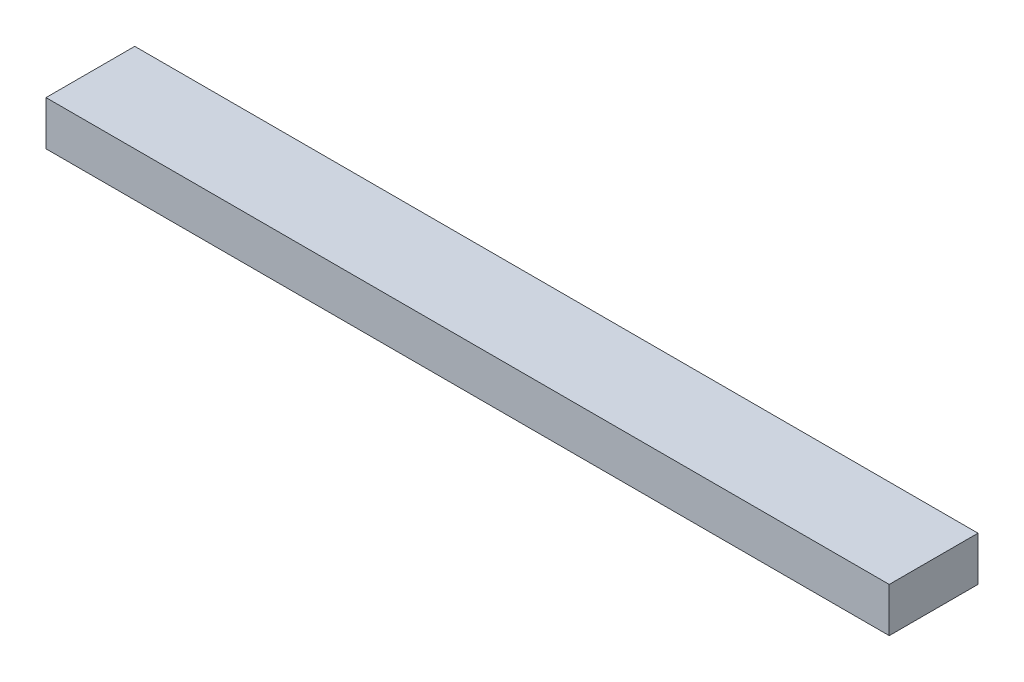
ISO-10303-21;
HEADER;
FILE_DESCRIPTION(('STEP AP214'),'2;1');
FILE_NAME('part.step','',(''),(''),'','','');
FILE_SCHEMA(('AUTOMOTIVE_DESIGN { 1 0 10303 214 1 1 1 1 }'));
ENDSEC;
DATA;
#1=APPLICATION_CONTEXT('core data for automotive mechanical design processes');
#2=APPLICATION_PROTOCOL_DEFINITION('international standard','automotive_design',2000,#1);
#3=PRODUCT_CONTEXT('',#1,'mechanical');
#4=PRODUCT('Part','Part','',(#3));
#5=PRODUCT_RELATED_PRODUCT_CATEGORY('part','',(#4));
#6=PRODUCT_DEFINITION_FORMATION('','',#4);
#7=PRODUCT_DEFINITION_CONTEXT('part definition',#1,'design');
#8=PRODUCT_DEFINITION('design','',#6,#7);
#9=PRODUCT_DEFINITION_SHAPE('','',#8);
#10=(LENGTH_UNIT() NAMED_UNIT(*) SI_UNIT(.MILLI.,.METRE.));
#11=(NAMED_UNIT(*) PLANE_ANGLE_UNIT() SI_UNIT($,.RADIAN.));
#12=(NAMED_UNIT(*) SI_UNIT($,.STERADIAN.) SOLID_ANGLE_UNIT());
#13=UNCERTAINTY_MEASURE_WITH_UNIT(LENGTH_MEASURE(1.E-05),#10,'distance_accuracy_value','');
#14=(GEOMETRIC_REPRESENTATION_CONTEXT(3) GLOBAL_UNCERTAINTY_ASSIGNED_CONTEXT((#13)) GLOBAL_UNIT_ASSIGNED_CONTEXT((#10,
#11,#12)) REPRESENTATION_CONTEXT('',''));
#15=CARTESIAN_POINT('',(0.,0.,0.));
#16=DIRECTION('',(0.,0.,1.));
#17=DIRECTION('',(1.,0.,0.));
#18=AXIS2_PLACEMENT_3D('',#15,#16,#17);
#19=CARTESIAN_POINT('',(-53.9405868037197,12.7,-28.9440161104718));
#20=DIRECTION('',(1.,0.,0.));
#21=DIRECTION('',(0.,0.,-1.));
#22=AXIS2_PLACEMENT_3D('',#19,#20,#21);
#23=PLANE('',#22);
#24=DIRECTION('',(0.,0.,1.));
#25=VECTOR('',#24,1.);
#26=CARTESIAN_POINT('',(-53.9405868037197,0.,-28.9440161104718));
#27=LINE('',#26,#25);
#28=CARTESIAN_POINT('',(-53.9405868037197,0.,-28.9440161104718));
#29=VERTEX_POINT('',#28);
#30=CARTESIAN_POINT('',(-53.9405868037197,0.,-3.5440161104718));
#31=VERTEX_POINT('',#30);
#32=EDGE_CURVE('E107',#29,#31,#27,.T.);
#33=ORIENTED_EDGE('',*,*,#32,.T.);
#34=DIRECTION('',(0.,-1.,0.));
#35=VECTOR('',#34,1.);
#36=CARTESIAN_POINT('',(-53.9405868037197,12.7,-3.5440161104718));
#37=LINE('',#36,#35);
#38=CARTESIAN_POINT('',(-53.9405868037197,12.7,-3.5440161104718));
#39=VERTEX_POINT('',#38);
#40=EDGE_CURVE('E11',#39,#31,#37,.T.);
#41=ORIENTED_EDGE('',*,*,#40,.F.);
#42=DIRECTION('',(0.,0.,1.));
#43=VECTOR('',#42,1.);
#44=CARTESIAN_POINT('',(-53.9405868037197,12.7,-28.9440161104718));
#45=LINE('',#44,#43);
#46=CARTESIAN_POINT('',(-53.9405868037197,12.7,-28.9440161104718));
#47=VERTEX_POINT('',#46);
#48=EDGE_CURVE('E91',#47,#39,#45,.T.);
#49=ORIENTED_EDGE('',*,*,#48,.F.);
#50=DIRECTION('',(0.,-1.,0.));
#51=VECTOR('',#50,1.);
#52=CARTESIAN_POINT('',(-53.9405868037197,12.7,-28.9440161104718));
#53=LINE('',#52,#51);
#54=EDGE_CURVE('E103',#47,#29,#53,.T.);
#55=ORIENTED_EDGE('',*,*,#54,.T.);
#56=EDGE_LOOP('',(#33,#41,#49,#55));
#57=FACE_BOUND('',#56,.T.);
#58=ADVANCED_FACE('F39',(#57),#23,.F.);
#59=CARTESIAN_POINT('',(-53.9405868037197,12.7,-3.5440161104718));
#60=DIRECTION('',(0.,0.,-1.));
#61=DIRECTION('',(-1.,0.,0.));
#62=AXIS2_PLACEMENT_3D('',#59,#60,#61);
#63=PLANE('',#62);
#64=DIRECTION('',(1.,0.,0.));
#65=VECTOR('',#64,1.);
#66=CARTESIAN_POINT('',(-53.9405868037197,0.,-3.5440161104718));
#67=LINE('',#66,#65);
#68=CARTESIAN_POINT('',(187.35941319628,0.,-3.5440161104718));
#69=VERTEX_POINT('',#68);
#70=EDGE_CURVE('E96',#31,#69,#67,.T.);
#71=ORIENTED_EDGE('',*,*,#70,.T.);
#72=DIRECTION('',(0.,-1.,0.));
#73=VECTOR('',#72,1.);
#74=CARTESIAN_POINT('',(187.35941319628,12.7,-3.5440161104718));
#75=LINE('',#74,#73);
#76=CARTESIAN_POINT('',(187.35941319628,12.7,-3.5440161104718));
#77=VERTEX_POINT('',#76);
#78=EDGE_CURVE('E48',#77,#69,#75,.T.);
#79=ORIENTED_EDGE('',*,*,#78,.F.);
#80=DIRECTION('',(1.,0.,0.));
#81=VECTOR('',#80,1.);
#82=CARTESIAN_POINT('',(-53.9405868037197,12.7,-3.5440161104718));
#83=LINE('',#82,#81);
#84=EDGE_CURVE('E86',#39,#77,#83,.T.);
#85=ORIENTED_EDGE('',*,*,#84,.F.);
#86=ORIENTED_EDGE('',*,*,#40,.T.);
#87=EDGE_LOOP('',(#71,#79,#85,#86));
#88=FACE_BOUND('',#87,.T.);
#89=ADVANCED_FACE('F95',(#88),#63,.F.);
#90=CARTESIAN_POINT('',(187.35941319628,12.7,-28.9440161104718));
#91=DIRECTION('',(-1.,0.,0.));
#92=DIRECTION('',(0.,0.,1.));
#93=AXIS2_PLACEMENT_3D('',#90,#91,#92);
#94=PLANE('',#93);
#95=DIRECTION('',(0.,0.,-1.));
#96=VECTOR('',#95,1.);
#97=CARTESIAN_POINT('',(187.35941319628,0.,-28.9440161104718));
#98=LINE('',#97,#96);
#99=CARTESIAN_POINT('',(187.35941319628,0.,-28.9440161104718));
#100=VERTEX_POINT('',#99);
#101=EDGE_CURVE('E73',#69,#100,#98,.T.);
#102=ORIENTED_EDGE('',*,*,#101,.T.);
#103=DIRECTION('',(0.,-1.,0.));
#104=VECTOR('',#103,1.);
#105=CARTESIAN_POINT('',(187.35941319628,12.7,-28.9440161104718));
#106=LINE('',#105,#104);
#107=CARTESIAN_POINT('',(187.35941319628,12.7,-28.9440161104718));
#108=VERTEX_POINT('',#107);
#109=EDGE_CURVE('E98',#108,#100,#106,.T.);
#110=ORIENTED_EDGE('',*,*,#109,.F.);
#111=DIRECTION('',(0.,0.,-1.));
#112=VECTOR('',#111,1.);
#113=CARTESIAN_POINT('',(187.35941319628,12.7,-28.9440161104718));
#114=LINE('',#113,#112);
#115=EDGE_CURVE('E89',#77,#108,#114,.T.);
#116=ORIENTED_EDGE('',*,*,#115,.F.);
#117=ORIENTED_EDGE('',*,*,#78,.T.);
#118=EDGE_LOOP('',(#102,#110,#116,#117));
#119=FACE_BOUND('',#118,.T.);
#120=ADVANCED_FACE('F99',(#119),#94,.F.);
#121=CARTESIAN_POINT('',(-53.9405868037197,12.7,-28.9440161104718));
#122=DIRECTION('',(0.,0.,1.));
#123=DIRECTION('',(1.,0.,0.));
#124=AXIS2_PLACEMENT_3D('',#121,#122,#123);
#125=PLANE('',#124);
#126=DIRECTION('',(-1.,0.,0.));
#127=VECTOR('',#126,1.);
#128=CARTESIAN_POINT('',(-53.9405868037197,0.,-28.9440161104718));
#129=LINE('',#128,#127);
#130=EDGE_CURVE('E79',#100,#29,#129,.T.);
#131=ORIENTED_EDGE('',*,*,#130,.T.);
#132=ORIENTED_EDGE('',*,*,#54,.F.);
#133=DIRECTION('',(-1.,0.,0.));
#134=VECTOR('',#133,1.);
#135=CARTESIAN_POINT('',(-53.9405868037197,12.7,-28.9440161104718));
#136=LINE('',#135,#134);
#137=EDGE_CURVE('E56',#108,#47,#136,.T.);
#138=ORIENTED_EDGE('',*,*,#137,.F.);
#139=ORIENTED_EDGE('',*,*,#109,.T.);
#140=EDGE_LOOP('',(#131,#132,#138,#139));
#141=FACE_BOUND('',#140,.T.);
#142=ADVANCED_FACE('F120',(#141),#125,.F.);
#143=CARTESIAN_POINT('',(0.,12.7,0.));
#144=DIRECTION('',(0.,1.,0.));
#145=DIRECTION('',(0.,0.,1.));
#146=AXIS2_PLACEMENT_3D('',#143,#144,#145);
#147=PLANE('',#146);
#148=ORIENTED_EDGE('',*,*,#48,.T.);
#149=ORIENTED_EDGE('',*,*,#84,.T.);
#150=ORIENTED_EDGE('',*,*,#115,.T.);
#151=ORIENTED_EDGE('',*,*,#137,.T.);
#152=EDGE_LOOP('',(#148,#149,#150,#151));
#153=FACE_BOUND('',#152,.T.);
#154=ADVANCED_FACE('F87',(#153),#147,.T.);
#155=CARTESIAN_POINT('',(0.,0.,0.));
#156=DIRECTION('',(0.,1.,0.));
#157=DIRECTION('',(0.,0.,1.));
#158=AXIS2_PLACEMENT_3D('',#155,#156,#157);
#159=PLANE('',#158);
#160=ORIENTED_EDGE('',*,*,#32,.F.);
#161=ORIENTED_EDGE('',*,*,#130,.F.);
#162=ORIENTED_EDGE('',*,*,#101,.F.);
#163=ORIENTED_EDGE('',*,*,#70,.F.);
#164=EDGE_LOOP('',(#160,#161,#162,#163));
#165=FACE_BOUND('',#164,.T.);
#166=ADVANCED_FACE('F123',(#165),#159,.F.);
#167=CLOSED_SHELL('',(#58,#89,#120,#142,#154,#166));
#168=MANIFOLD_SOLID_BREP('B2',#167);
#169=ADVANCED_BREP_SHAPE_REPRESENTATION('',(#18,#168),#14);
#170=SHAPE_DEFINITION_REPRESENTATION(#9,#169);
ENDSEC;
END-ISO-10303-21;
